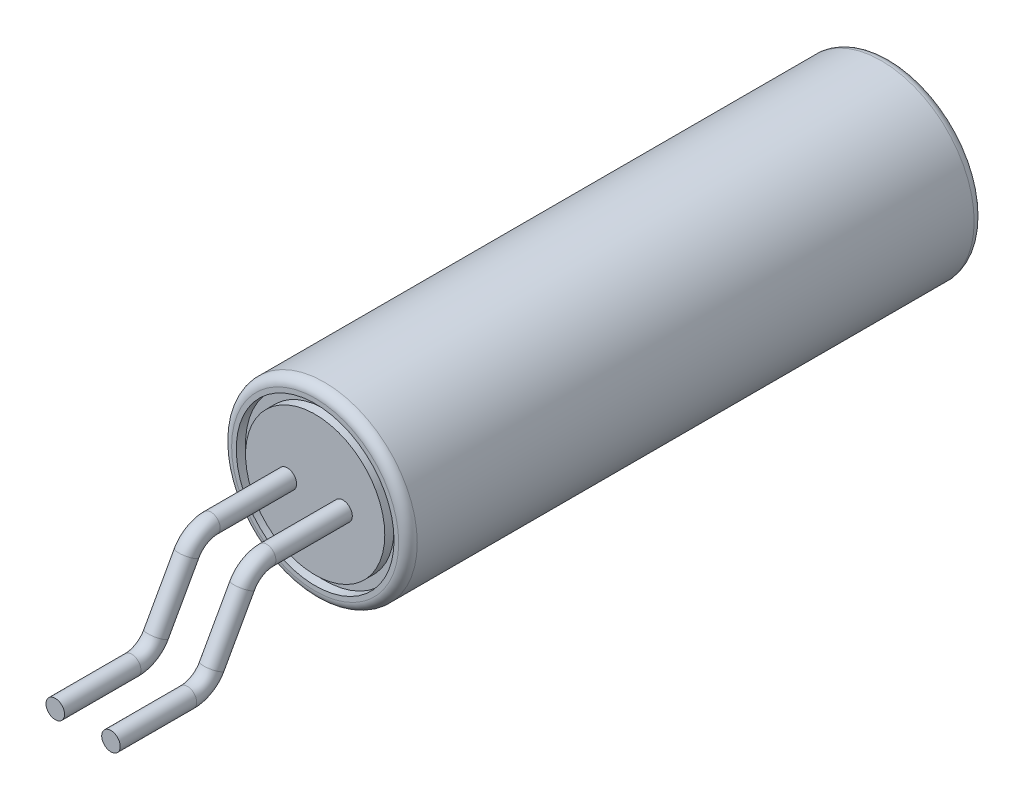
ISO-10303-21;
HEADER;
FILE_DESCRIPTION(('STEP AP214'),'2;1');
FILE_NAME('part.step','',(''),(''),'','','');
FILE_SCHEMA(('AUTOMOTIVE_DESIGN { 1 0 10303 214 1 1 1 1 }'));
ENDSEC;
DATA;
#1=APPLICATION_CONTEXT('core data for automotive mechanical design processes');
#2=APPLICATION_PROTOCOL_DEFINITION('international standard','automotive_design',2000,#1);
#3=PRODUCT_CONTEXT('',#1,'mechanical');
#4=PRODUCT('Part','Part','',(#3));
#5=PRODUCT_RELATED_PRODUCT_CATEGORY('part','',(#4));
#6=PRODUCT_DEFINITION_FORMATION('','',#4);
#7=PRODUCT_DEFINITION_CONTEXT('part definition',#1,'design');
#8=PRODUCT_DEFINITION('design','',#6,#7);
#9=PRODUCT_DEFINITION_SHAPE('','',#8);
#10=(LENGTH_UNIT() NAMED_UNIT(*) SI_UNIT(.MILLI.,.METRE.));
#11=(NAMED_UNIT(*) PLANE_ANGLE_UNIT() SI_UNIT($,.RADIAN.));
#12=(NAMED_UNIT(*) SI_UNIT($,.STERADIAN.) SOLID_ANGLE_UNIT());
#13=UNCERTAINTY_MEASURE_WITH_UNIT(LENGTH_MEASURE(1.E-05),#10,'distance_accuracy_value','');
#14=(GEOMETRIC_REPRESENTATION_CONTEXT(3) GLOBAL_UNCERTAINTY_ASSIGNED_CONTEXT((#13)) GLOBAL_UNIT_ASSIGNED_CONTEXT((#10,
#11,#12)) REPRESENTATION_CONTEXT('',''));
#15=CARTESIAN_POINT('',(0.,0.,0.));
#16=DIRECTION('',(0.,0.,1.));
#17=DIRECTION('',(1.,0.,0.));
#18=AXIS2_PLACEMENT_3D('',#15,#16,#17);
#19=CARTESIAN_POINT('',(0.3,0.1,2.5));
#20=DIRECTION('',(0.,0.,1.));
#21=DIRECTION('',(0.,-1.,0.));
#22=AXIS2_PLACEMENT_3D('',#19,#20,#21);
#23=PLANE('',#22);
#24=CARTESIAN_POINT('',(0.3,0.1,2.5));
#25=DIRECTION('',(0.,0.,1.));
#26=DIRECTION('',(0.,-1.,0.));
#27=AXIS2_PLACEMENT_3D('',#24,#25,#26);
#28=CIRCLE('',#27,0.1);
#29=CARTESIAN_POINT('',(0.3,0.,2.5));
#30=VERTEX_POINT('',#29);
#31=EDGE_CURVE('E216',#30,#30,#28,.F.);
#32=ORIENTED_EDGE('',*,*,#31,.F.);
#33=EDGE_LOOP('',(#32));
#34=FACE_BOUND('',#33,.T.);
#35=ADVANCED_FACE('F16',(#34),#23,.T.);
#36=CARTESIAN_POINT('',(-0.3,0.1,2.5));
#37=DIRECTION('',(0.,0.,1.));
#38=DIRECTION('',(0.,-1.,0.));
#39=AXIS2_PLACEMENT_3D('',#36,#37,#38);
#40=PLANE('',#39);
#41=CARTESIAN_POINT('',(-0.3,0.1,2.5));
#42=DIRECTION('',(0.,0.,1.));
#43=DIRECTION('',(0.,-1.,0.));
#44=AXIS2_PLACEMENT_3D('',#41,#42,#43);
#45=CIRCLE('',#44,0.1);
#46=CARTESIAN_POINT('',(-0.3,0.,2.5));
#47=VERTEX_POINT('',#46);
#48=EDGE_CURVE('E196',#47,#47,#45,.F.);
#49=ORIENTED_EDGE('',*,*,#48,.F.);
#50=EDGE_LOOP('',(#49));
#51=FACE_BOUND('',#50,.T.);
#52=ADVANCED_FACE('F326',(#51),#40,.T.);
#53=CARTESIAN_POINT('',(0.3,0.1,1.6765210047));
#54=DIRECTION('',(0.,0.,1.));
#55=DIRECTION('',(0.,-1.,0.));
#56=AXIS2_PLACEMENT_3D('',#53,#54,#55);
#57=CYLINDRICAL_SURFACE('',#56,0.1);
#58=ORIENTED_EDGE('',*,*,#31,.T.);
#59=EDGE_LOOP('',(#58));
#60=FACE_BOUND('',#59,.T.);
#61=CARTESIAN_POINT('',(0.3,0.1,1.6765210047));
#62=DIRECTION('',(0.,0.,1.));
#63=DIRECTION('',(0.,-1.,0.));
#64=AXIS2_PLACEMENT_3D('',#61,#62,#63);
#65=CIRCLE('',#64,0.1);
#66=CARTESIAN_POINT('',(0.3,0.,1.6765210047));
#67=VERTEX_POINT('',#66);
#68=EDGE_CURVE('E193',#67,#67,#65,.F.);
#69=ORIENTED_EDGE('',*,*,#68,.F.);
#70=EDGE_LOOP('',(#69));
#71=FACE_BOUND('',#70,.T.);
#72=ADVANCED_FACE('F319',(#60,#71),#57,.T.);
#73=CARTESIAN_POINT('',(-0.3,0.1,1.6765210047));
#74=DIRECTION('',(0.,0.,1.));
#75=DIRECTION('',(0.,-1.,0.));
#76=AXIS2_PLACEMENT_3D('',#73,#74,#75);
#77=CYLINDRICAL_SURFACE('',#76,0.1);
#78=ORIENTED_EDGE('',*,*,#48,.T.);
#79=EDGE_LOOP('',(#78));
#80=FACE_BOUND('',#79,.T.);
#81=CARTESIAN_POINT('',(-0.3,0.1,1.6765210047));
#82=DIRECTION('',(0.,0.,1.));
#83=DIRECTION('',(0.,-1.,0.));
#84=AXIS2_PLACEMENT_3D('',#81,#82,#83);
#85=CIRCLE('',#84,0.1);
#86=CARTESIAN_POINT('',(-0.3,0.,1.6765210047));
#87=VERTEX_POINT('',#86);
#88=EDGE_CURVE('E190',#87,#87,#85,.F.);
#89=ORIENTED_EDGE('',*,*,#88,.F.);
#90=EDGE_LOOP('',(#89));
#91=FACE_BOUND('',#90,.T.);
#92=ADVANCED_FACE('F185',(#80,#91),#77,.T.);
#93=CARTESIAN_POINT('',(0.3,0.4,1.6765210047));
#94=DIRECTION('',(-1.,0.,0.));
#95=DIRECTION('',(0.,0.,1.));
#96=AXIS2_PLACEMENT_3D('',#93,#94,#95);
#97=TOROIDAL_SURFACE('',#96,0.3,0.1);
#98=CARTESIAN_POINT('',(0.3,0.254307120646476,1.41427382186348));
#99=DIRECTION('',(0.,-0.874157276121491,0.485642931178717));
#100=DIRECTION('',(0.,-0.485642931178717,-0.874157276121491));
#101=AXIS2_PLACEMENT_3D('',#98,#99,#100);
#102=CIRCLE('',#101,0.1);
#103=CARTESIAN_POINT('',(0.3,0.205742827528604,1.32685809425133));
#104=VERTEX_POINT('',#103);
#105=EDGE_CURVE('E171',#104,#104,#102,.F.);
#106=ORIENTED_EDGE('',*,*,#105,.F.);
#107=EDGE_LOOP('',(#106));
#108=FACE_BOUND('',#107,.T.);
#109=ORIENTED_EDGE('',*,*,#68,.T.);
#110=EDGE_LOOP('',(#109));
#111=FACE_BOUND('',#110,.T.);
#112=ADVANCED_FACE('F181',(#108,#111),#97,.T.);
#113=CARTESIAN_POINT('',(-0.3,0.4,1.6765210047));
#114=DIRECTION('',(-1.,0.,0.));
#115=DIRECTION('',(0.,0.,1.));
#116=AXIS2_PLACEMENT_3D('',#113,#114,#115);
#117=TOROIDAL_SURFACE('',#116,0.3,0.1);
#118=CARTESIAN_POINT('',(-0.3,0.254307120646476,1.41427382186348));
#119=DIRECTION('',(0.,-0.874157276121491,0.485642931178717));
#120=DIRECTION('',(0.,-0.485642931178717,-0.874157276121491));
#121=AXIS2_PLACEMENT_3D('',#118,#119,#120);
#122=CIRCLE('',#121,0.1);
#123=CARTESIAN_POINT('',(-0.3,0.205742827528604,1.32685809425133));
#124=VERTEX_POINT('',#123);
#125=EDGE_CURVE('E168',#124,#124,#122,.F.);
#126=ORIENTED_EDGE('',*,*,#125,.F.);
#127=EDGE_LOOP('',(#126));
#128=FACE_BOUND('',#127,.T.);
#129=ORIENTED_EDGE('',*,*,#88,.T.);
#130=EDGE_LOOP('',(#129));
#131=FACE_BOUND('',#130,.T.);
#132=ADVANCED_FACE('F176',(#128,#131),#117,.T.);
#133=CARTESIAN_POINT('',(0.3,0.845692879354,1.085726178137));
#134=DIRECTION('',(0.,-0.874157276121491,0.485642931178717));
#135=DIRECTION('',(0.,-0.485642931178717,-0.874157276121491));
#136=AXIS2_PLACEMENT_3D('',#133,#134,#135);
#137=CYLINDRICAL_SURFACE('',#136,0.1);
#138=ORIENTED_EDGE('',*,*,#105,.T.);
#139=EDGE_LOOP('',(#138));
#140=FACE_BOUND('',#139,.T.);
#141=CARTESIAN_POINT('',(0.3,0.845692879353207,1.08572617813667));
#142=DIRECTION('',(0.,-0.874157276122245,0.485642931177358));
#143=DIRECTION('',(0.,0.485642931177358,0.874157276122245));
#144=AXIS2_PLACEMENT_3D('',#141,#142,#143);
#145=CIRCLE('',#144,0.1);
#146=CARTESIAN_POINT('',(0.3,0.894257172470943,1.1731419057489));
#147=VERTEX_POINT('',#146);
#148=EDGE_CURVE('E165',#147,#147,#145,.F.);
#149=ORIENTED_EDGE('',*,*,#148,.F.);
#150=EDGE_LOOP('',(#149));
#151=FACE_BOUND('',#150,.T.);
#152=ADVANCED_FACE('F180',(#140,#151),#137,.T.);
#153=CARTESIAN_POINT('',(-0.3,0.845692879354,1.085726178137));
#154=DIRECTION('',(0.,-0.874157276121491,0.485642931178717));
#155=DIRECTION('',(0.,-0.485642931178717,-0.874157276121491));
#156=AXIS2_PLACEMENT_3D('',#153,#154,#155);
#157=CYLINDRICAL_SURFACE('',#156,0.1);
#158=ORIENTED_EDGE('',*,*,#125,.T.);
#159=EDGE_LOOP('',(#158));
#160=FACE_BOUND('',#159,.T.);
#161=CARTESIAN_POINT('',(-0.3,0.845692879353207,1.08572617813667));
#162=DIRECTION('',(0.,-0.874157276122245,0.485642931177358));
#163=DIRECTION('',(0.,0.485642931177358,0.874157276122245));
#164=AXIS2_PLACEMENT_3D('',#161,#162,#163);
#165=CIRCLE('',#164,0.1);
#166=CARTESIAN_POINT('',(-0.3,0.894257172470943,1.1731419057489));
#167=VERTEX_POINT('',#166);
#168=EDGE_CURVE('E160',#167,#167,#165,.F.);
#169=ORIENTED_EDGE('',*,*,#168,.F.);
#170=EDGE_LOOP('',(#169));
#171=FACE_BOUND('',#170,.T.);
#172=ADVANCED_FACE('F292',(#160,#171),#157,.T.);
#173=CARTESIAN_POINT('',(0.3,0.7,0.8234789953));
#174=DIRECTION('',(1.,0.,0.));
#175=DIRECTION('',(0.,0.,-1.));
#176=AXIS2_PLACEMENT_3D('',#173,#174,#175);
#177=TOROIDAL_SURFACE('',#176,0.3,0.1);
#178=ORIENTED_EDGE('',*,*,#148,.T.);
#179=EDGE_LOOP('',(#178));
#180=FACE_BOUND('',#179,.T.);
#181=CARTESIAN_POINT('',(0.3,1.,0.8234789953));
#182=DIRECTION('',(0.,0.,-1.));
#183=DIRECTION('',(0.,1.,0.));
#184=AXIS2_PLACEMENT_3D('',#181,#182,#183);
#185=CIRCLE('',#184,0.1);
#186=CARTESIAN_POINT('',(0.3,1.1,0.8234789953));
#187=VERTEX_POINT('',#186);
#188=EDGE_CURVE('E158',#187,#187,#185,.T.);
#189=ORIENTED_EDGE('',*,*,#188,.F.);
#190=EDGE_LOOP('',(#189));
#191=FACE_BOUND('',#190,.T.);
#192=ADVANCED_FACE('F152',(#180,#191),#177,.T.);
#193=CARTESIAN_POINT('',(-0.3,0.7,0.8234789953));
#194=DIRECTION('',(1.,0.,0.));
#195=DIRECTION('',(0.,0.,-1.));
#196=AXIS2_PLACEMENT_3D('',#193,#194,#195);
#197=TOROIDAL_SURFACE('',#196,0.3,0.1);
#198=ORIENTED_EDGE('',*,*,#168,.T.);
#199=EDGE_LOOP('',(#198));
#200=FACE_BOUND('',#199,.T.);
#201=CARTESIAN_POINT('',(-0.3,1.,0.8234789953));
#202=DIRECTION('',(0.,0.,-1.));
#203=DIRECTION('',(0.,1.,0.));
#204=AXIS2_PLACEMENT_3D('',#201,#202,#203);
#205=CIRCLE('',#204,0.1);
#206=CARTESIAN_POINT('',(-0.3,1.1,0.8234789953));
#207=VERTEX_POINT('',#206);
#208=EDGE_CURVE('E64',#207,#207,#205,.T.);
#209=ORIENTED_EDGE('',*,*,#208,.F.);
#210=EDGE_LOOP('',(#209));
#211=FACE_BOUND('',#210,.T.);
#212=ADVANCED_FACE('F148',(#200,#211),#197,.T.);
#213=CARTESIAN_POINT('',(0.3,1.,0.8234789953));
#214=DIRECTION('',(0.,0.,-1.));
#215=DIRECTION('',(0.,1.,0.));
#216=AXIS2_PLACEMENT_3D('',#213,#214,#215);
#217=CYLINDRICAL_SURFACE('',#216,0.1);
#218=CARTESIAN_POINT('',(0.3,1.,0.));
#219=DIRECTION('',(0.,0.,-1.));
#220=DIRECTION('',(0.,1.,0.));
#221=AXIS2_PLACEMENT_3D('',#218,#219,#220);
#222=CIRCLE('',#221,0.1);
#223=CARTESIAN_POINT('',(0.3,1.1,0.));
#224=VERTEX_POINT('',#223);
#225=EDGE_CURVE('E211',#224,#224,#222,.T.);
#226=ORIENTED_EDGE('',*,*,#225,.F.);
#227=EDGE_LOOP('',(#226));
#228=FACE_BOUND('',#227,.T.);
#229=ORIENTED_EDGE('',*,*,#188,.T.);
#230=EDGE_LOOP('',(#229));
#231=FACE_BOUND('',#230,.T.);
#232=ADVANCED_FACE('F144',(#228,#231),#217,.T.);
#233=CARTESIAN_POINT('',(-0.3,1.,0.8234789953));
#234=DIRECTION('',(0.,0.,-1.));
#235=DIRECTION('',(0.,1.,0.));
#236=AXIS2_PLACEMENT_3D('',#233,#234,#235);
#237=CYLINDRICAL_SURFACE('',#236,0.1);
#238=CARTESIAN_POINT('',(-0.3,1.,0.));
#239=DIRECTION('',(0.,0.,-1.));
#240=DIRECTION('',(0.,1.,0.));
#241=AXIS2_PLACEMENT_3D('',#238,#239,#240);
#242=CIRCLE('',#241,0.1);
#243=CARTESIAN_POINT('',(-0.3,1.1,0.));
#244=VERTEX_POINT('',#243);
#245=EDGE_CURVE('E208',#244,#244,#242,.T.);
#246=ORIENTED_EDGE('',*,*,#245,.F.);
#247=EDGE_LOOP('',(#246));
#248=FACE_BOUND('',#247,.T.);
#249=ORIENTED_EDGE('',*,*,#208,.T.);
#250=EDGE_LOOP('',(#249));
#251=FACE_BOUND('',#250,.T.);
#252=ADVANCED_FACE('F140',(#248,#251),#237,.T.);
#253=CARTESIAN_POINT('',(0.,1.,0.));
#254=DIRECTION('',(0.,0.,1.));
#255=DIRECTION('',(1.,0.,0.));
#256=AXIS2_PLACEMENT_3D('',#253,#254,#255);
#257=PLANE('',#256);
#258=CARTESIAN_POINT('',(0.,1.,0.));
#259=DIRECTION('',(0.,0.,1.));
#260=DIRECTION('',(1.,0.,0.));
#261=AXIS2_PLACEMENT_3D('',#258,#259,#260);
#262=CIRCLE('',#261,0.75);
#263=CARTESIAN_POINT('',(0.75,1.,0.));
#264=VERTEX_POINT('',#263);
#265=EDGE_CURVE('E205',#264,#264,#262,.F.);
#266=ORIENTED_EDGE('',*,*,#265,.F.);
#267=EDGE_LOOP('',(#266));
#268=FACE_BOUND('',#267,.T.);
#269=ORIENTED_EDGE('',*,*,#245,.T.);
#270=EDGE_LOOP('',(#269));
#271=FACE_BOUND('',#270,.T.);
#272=ORIENTED_EDGE('',*,*,#225,.T.);
#273=EDGE_LOOP('',(#272));
#274=FACE_BOUND('',#273,.T.);
#275=ADVANCED_FACE('F136',(#268,#271,#274),#257,.T.);
#276=CARTESIAN_POINT('',(0.,1.,-0.1));
#277=DIRECTION('',(0.,0.,1.));
#278=DIRECTION('',(1.,0.,0.));
#279=AXIS2_PLACEMENT_3D('',#276,#277,#278);
#280=CYLINDRICAL_SURFACE('',#279,0.75);
#281=CARTESIAN_POINT('',(0.,1.,-0.1));
#282=DIRECTION('',(0.,0.,1.));
#283=DIRECTION('',(1.,0.,0.));
#284=AXIS2_PLACEMENT_3D('',#281,#282,#283);
#285=CIRCLE('',#284,0.75);
#286=CARTESIAN_POINT('',(0.75,1.,-0.1));
#287=VERTEX_POINT('',#286);
#288=EDGE_CURVE('E202',#287,#287,#285,.F.);
#289=ORIENTED_EDGE('',*,*,#288,.F.);
#290=EDGE_LOOP('',(#289));
#291=FACE_BOUND('',#290,.T.);
#292=ORIENTED_EDGE('',*,*,#265,.T.);
#293=EDGE_LOOP('',(#292));
#294=FACE_BOUND('',#293,.T.);
#295=ADVANCED_FACE('F132',(#291,#294),#280,.T.);
#296=CARTESIAN_POINT('',(0.,1.,-0.1));
#297=DIRECTION('',(0.,0.,1.));
#298=DIRECTION('',(1.,0.,0.));
#299=AXIS2_PLACEMENT_3D('',#296,#297,#298);
#300=PLANE('',#299);
#301=CARTESIAN_POINT('',(0.,1.,-0.1));
#302=DIRECTION('',(0.,0.,1.));
#303=DIRECTION('',(1.,0.,0.));
#304=AXIS2_PLACEMENT_3D('',#301,#302,#303);
#305=CIRCLE('',#304,0.85);
#306=CARTESIAN_POINT('',(0.85,1.,-0.1));
#307=VERTEX_POINT('',#306);
#308=EDGE_CURVE('E199',#307,#307,#305,.T.);
#309=ORIENTED_EDGE('',*,*,#308,.T.);
#310=EDGE_LOOP('',(#309));
#311=FACE_BOUND('',#310,.T.);
#312=ORIENTED_EDGE('',*,*,#288,.T.);
#313=EDGE_LOOP('',(#312));
#314=FACE_BOUND('',#313,.T.);
#315=ADVANCED_FACE('F128',(#311,#314),#300,.T.);
#316=CARTESIAN_POINT('',(0.,1.,-0.1));
#317=DIRECTION('',(0.,0.,1.));
#318=DIRECTION('',(1.,0.,0.));
#319=AXIS2_PLACEMENT_3D('',#316,#317,#318);
#320=CYLINDRICAL_SURFACE('',#319,0.85);
#321=CARTESIAN_POINT('',(0.,1.,0.));
#322=DIRECTION('',(0.,0.,1.));
#323=DIRECTION('',(1.,0.,0.));
#324=AXIS2_PLACEMENT_3D('',#321,#322,#323);
#325=CIRCLE('',#324,0.85);
#326=CARTESIAN_POINT('',(0.85,1.,0.));
#327=VERTEX_POINT('',#326);
#328=EDGE_CURVE('E51',#327,#327,#325,.F.);
#329=ORIENTED_EDGE('',*,*,#328,.F.);
#330=EDGE_LOOP('',(#329));
#331=FACE_BOUND('',#330,.T.);
#332=ORIENTED_EDGE('',*,*,#308,.F.);
#333=EDGE_LOOP('',(#332));
#334=FACE_BOUND('',#333,.T.);
#335=ADVANCED_FACE('F124',(#331,#334),#320,.F.);
#336=CARTESIAN_POINT('',(0.,1.,-6.2));
#337=DIRECTION('',(0.,0.,1.));
#338=DIRECTION('',(1.,0.,0.));
#339=AXIS2_PLACEMENT_3D('',#336,#337,#338);
#340=PLANE('',#339);
#341=CARTESIAN_POINT('',(0.,1.,-6.2));
#342=DIRECTION('',(0.,0.,1.));
#343=DIRECTION('',(1.,0.,0.));
#344=AXIS2_PLACEMENT_3D('',#341,#342,#343);
#345=CIRCLE('',#344,0.9);
#346=CARTESIAN_POINT('',(0.9,1.,-6.2));
#347=VERTEX_POINT('',#346);
#348=CARTESIAN_POINT('',(-0.9,1.,-6.2));
#349=VERTEX_POINT('',#348);
#350=EDGE_CURVE('E44',#347,#349,#345,.T.);
#351=ORIENTED_EDGE('',*,*,#350,.F.);
#352=CARTESIAN_POINT('',(0.,1.,-6.2));
#353=DIRECTION('',(0.,0.,1.));
#354=DIRECTION('',(-1.,0.,0.));
#355=AXIS2_PLACEMENT_3D('',#352,#353,#354);
#356=CIRCLE('',#355,0.9);
#357=EDGE_CURVE('E47',#349,#347,#356,.T.);
#358=ORIENTED_EDGE('',*,*,#357,.F.);
#359=EDGE_LOOP('',(#351,#358));
#360=FACE_BOUND('',#359,.T.);
#361=ADVANCED_FACE('F49',(#360),#340,.F.);
#362=CARTESIAN_POINT('',(0.,1.,0.));
#363=DIRECTION('',(0.,0.,1.));
#364=DIRECTION('',(1.,0.,0.));
#365=AXIS2_PLACEMENT_3D('',#362,#363,#364);
#366=PLANE('',#365);
#367=CARTESIAN_POINT('',(0.,1.,0.));
#368=DIRECTION('',(0.,0.,-1.));
#369=DIRECTION('',(-1.,0.,0.));
#370=AXIS2_PLACEMENT_3D('',#367,#368,#369);
#371=CIRCLE('',#370,0.9);
#372=CARTESIAN_POINT('',(-0.9,1.,0.));
#373=VERTEX_POINT('',#372);
#374=CARTESIAN_POINT('',(0.9,1.,0.));
#375=VERTEX_POINT('',#374);
#376=EDGE_CURVE('E56',#373,#375,#371,.T.);
#377=ORIENTED_EDGE('',*,*,#376,.F.);
#378=CARTESIAN_POINT('',(0.,1.,0.));
#379=DIRECTION('',(0.,0.,-1.));
#380=DIRECTION('',(1.,0.,0.));
#381=AXIS2_PLACEMENT_3D('',#378,#379,#380);
#382=CIRCLE('',#381,0.9);
#383=EDGE_CURVE('E35',#375,#373,#382,.T.);
#384=ORIENTED_EDGE('',*,*,#383,.F.);
#385=EDGE_LOOP('',(#377,#384));
#386=FACE_BOUND('',#385,.T.);
#387=ORIENTED_EDGE('',*,*,#328,.T.);
#388=EDGE_LOOP('',(#387));
#389=FACE_BOUND('',#388,.T.);
#390=ADVANCED_FACE('F77',(#386,#389),#366,.T.);
#391=CARTESIAN_POINT('',(0.,1.,-6.1));
#392=DIRECTION('',(0.,0.,1.));
#393=DIRECTION('',(1.,0.,0.));
#394=AXIS2_PLACEMENT_3D('',#391,#392,#393);
#395=TOROIDAL_SURFACE('',#394,0.9,0.1);
#396=CARTESIAN_POINT('',(0.,1.,-6.1));
#397=DIRECTION('',(0.,0.,1.));
#398=DIRECTION('',(1.,0.,0.));
#399=AXIS2_PLACEMENT_3D('',#396,#397,#398);
#400=CIRCLE('',#399,1.);
#401=CARTESIAN_POINT('',(1.,1.,-6.1));
#402=VERTEX_POINT('',#401);
#403=EDGE_CURVE('E27',#402,#402,#400,.T.);
#404=ORIENTED_EDGE('',*,*,#403,.F.);
#405=EDGE_LOOP('',(#404));
#406=FACE_BOUND('',#405,.T.);
#407=ORIENTED_EDGE('',*,*,#350,.T.);
#408=ORIENTED_EDGE('',*,*,#357,.T.);
#409=EDGE_LOOP('',(#407,#408));
#410=FACE_BOUND('',#409,.T.);
#411=ADVANCED_FACE('F55',(#406,#410),#395,.T.);
#412=CARTESIAN_POINT('',(0.,1.,-0.1));
#413=DIRECTION('',(0.,0.,1.));
#414=DIRECTION('',(1.,0.,0.));
#415=AXIS2_PLACEMENT_3D('',#412,#413,#414);
#416=TOROIDAL_SURFACE('',#415,0.9,0.1);
#417=ORIENTED_EDGE('',*,*,#383,.T.);
#418=ORIENTED_EDGE('',*,*,#376,.T.);
#419=EDGE_LOOP('',(#417,#418));
#420=FACE_BOUND('',#419,.T.);
#421=CARTESIAN_POINT('',(0.,1.,-0.1));
#422=DIRECTION('',(0.,0.,1.));
#423=DIRECTION('',(1.,0.,0.));
#424=AXIS2_PLACEMENT_3D('',#421,#422,#423);
#425=CIRCLE('',#424,1.);
#426=CARTESIAN_POINT('',(1.,1.,-0.1));
#427=VERTEX_POINT('',#426);
#428=EDGE_CURVE('E11',#427,#427,#425,.F.);
#429=ORIENTED_EDGE('',*,*,#428,.F.);
#430=EDGE_LOOP('',(#429));
#431=FACE_BOUND('',#430,.T.);
#432=ADVANCED_FACE('F76',(#420,#431),#416,.T.);
#433=CARTESIAN_POINT('',(0.,1.,-6.2));
#434=DIRECTION('',(0.,0.,1.));
#435=DIRECTION('',(1.,0.,0.));
#436=AXIS2_PLACEMENT_3D('',#433,#434,#435);
#437=CYLINDRICAL_SURFACE('',#436,1.);
#438=ORIENTED_EDGE('',*,*,#428,.T.);
#439=EDGE_LOOP('',(#438));
#440=FACE_BOUND('',#439,.T.);
#441=ORIENTED_EDGE('',*,*,#403,.T.);
#442=EDGE_LOOP('',(#441));
#443=FACE_BOUND('',#442,.T.);
#444=ADVANCED_FACE('F229',(#440,#443),#437,.T.);
#445=CLOSED_SHELL('',(#35,#52,#72,#92,#112,#132,#152,#172,#192,#212,#232,#252,#275,#295,#315,
#335,#361,#390,#411,#432,#444));
#446=MANIFOLD_SOLID_BREP('B1',#445);
#447=ADVANCED_BREP_SHAPE_REPRESENTATION('',(#18,#446),#14);
#448=SHAPE_DEFINITION_REPRESENTATION(#9,#447);
ENDSEC;
END-ISO-10303-21;
